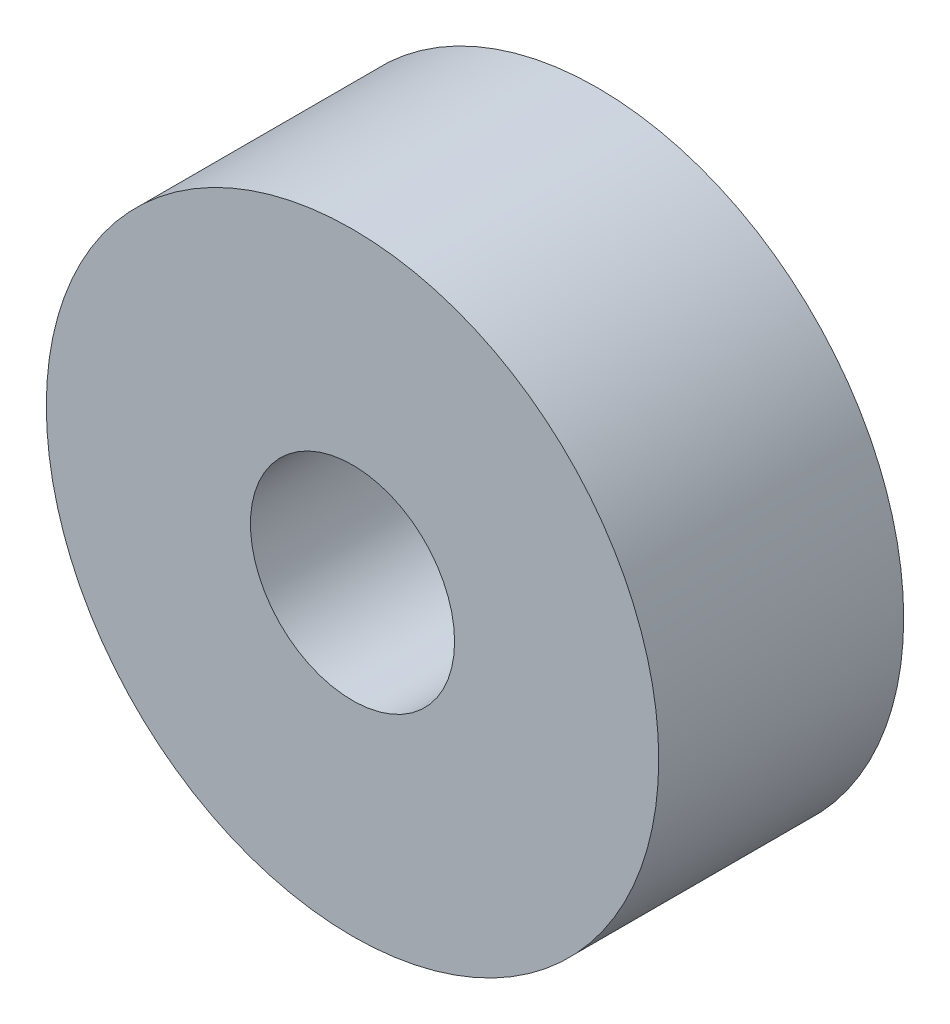
ISO-10303-21;
HEADER;
FILE_DESCRIPTION(('STEP AP214'),'2;1');
FILE_NAME('part.step','',(''),(''),'','','');
FILE_SCHEMA(('AUTOMOTIVE_DESIGN { 1 0 10303 214 1 1 1 1 }'));
ENDSEC;
DATA;
#1=APPLICATION_CONTEXT('core data for automotive mechanical design processes');
#2=APPLICATION_PROTOCOL_DEFINITION('international standard','automotive_design',2000,#1);
#3=PRODUCT_CONTEXT('',#1,'mechanical');
#4=PRODUCT('Part','Part','',(#3));
#5=PRODUCT_RELATED_PRODUCT_CATEGORY('part','',(#4));
#6=PRODUCT_DEFINITION_FORMATION('','',#4);
#7=PRODUCT_DEFINITION_CONTEXT('part definition',#1,'design');
#8=PRODUCT_DEFINITION('design','',#6,#7);
#9=PRODUCT_DEFINITION_SHAPE('','',#8);
#10=(LENGTH_UNIT() NAMED_UNIT(*) SI_UNIT(.MILLI.,.METRE.));
#11=(NAMED_UNIT(*) PLANE_ANGLE_UNIT() SI_UNIT($,.RADIAN.));
#12=(NAMED_UNIT(*) SI_UNIT($,.STERADIAN.) SOLID_ANGLE_UNIT());
#13=UNCERTAINTY_MEASURE_WITH_UNIT(LENGTH_MEASURE(1.E-05),#10,'distance_accuracy_value','');
#14=(GEOMETRIC_REPRESENTATION_CONTEXT(3) GLOBAL_UNCERTAINTY_ASSIGNED_CONTEXT((#13)) GLOBAL_UNIT_ASSIGNED_CONTEXT((#10,
#11,#12)) REPRESENTATION_CONTEXT('',''));
#15=CARTESIAN_POINT('',(0.,0.,0.));
#16=DIRECTION('',(0.,0.,1.));
#17=DIRECTION('',(1.,0.,0.));
#18=AXIS2_PLACEMENT_3D('',#15,#16,#17);
#19=CARTESIAN_POINT('',(0.,0.,60.));
#20=DIRECTION('',(0.,0.,-1.));
#21=DIRECTION('',(-1.,0.,0.));
#22=AXIS2_PLACEMENT_3D('',#19,#20,#21);
#23=CYLINDRICAL_SURFACE('',#22,75.);
#24=CARTESIAN_POINT('',(0.,0.,60.));
#25=DIRECTION('',(0.,0.,1.));
#26=DIRECTION('',(1.,0.,0.));
#27=AXIS2_PLACEMENT_3D('',#24,#25,#26);
#28=CIRCLE('',#27,75.);
#29=CARTESIAN_POINT('',(75.,0.,60.));
#30=VERTEX_POINT('',#29);
#31=EDGE_CURVE('E10',#30,#30,#28,.T.);
#32=ORIENTED_EDGE('',*,*,#31,.F.);
#33=EDGE_LOOP('',(#32));
#34=FACE_BOUND('',#33,.T.);
#35=CARTESIAN_POINT('',(0.,0.,0.));
#36=DIRECTION('',(0.,0.,1.));
#37=DIRECTION('',(1.,0.,0.));
#38=AXIS2_PLACEMENT_3D('',#35,#36,#37);
#39=CIRCLE('',#38,75.);
#40=CARTESIAN_POINT('',(75.,0.,0.));
#41=VERTEX_POINT('',#40);
#42=EDGE_CURVE('E33',#41,#41,#39,.T.);
#43=ORIENTED_EDGE('',*,*,#42,.T.);
#44=EDGE_LOOP('',(#43));
#45=FACE_BOUND('',#44,.T.);
#46=ADVANCED_FACE('F30',(#34,#45),#23,.T.);
#47=CARTESIAN_POINT('',(0.,0.,60.));
#48=DIRECTION('',(0.,0.,1.));
#49=DIRECTION('',(1.,0.,0.));
#50=AXIS2_PLACEMENT_3D('',#47,#48,#49);
#51=PLANE('',#50);
#52=CARTESIAN_POINT('',(0.,0.,60.));
#53=DIRECTION('',(0.,0.,1.));
#54=DIRECTION('',(1.,0.,0.));
#55=AXIS2_PLACEMENT_3D('',#52,#53,#54);
#56=CIRCLE('',#55,25.);
#57=CARTESIAN_POINT('',(25.,0.,60.));
#58=VERTEX_POINT('',#57);
#59=EDGE_CURVE('E42',#58,#58,#56,.T.);
#60=ORIENTED_EDGE('',*,*,#59,.F.);
#61=EDGE_LOOP('',(#60));
#62=FACE_BOUND('',#61,.T.);
#63=ORIENTED_EDGE('',*,*,#31,.T.);
#64=EDGE_LOOP('',(#63));
#65=FACE_BOUND('',#64,.T.);
#66=ADVANCED_FACE('F57',(#62,#65),#51,.T.);
#67=CARTESIAN_POINT('',(0.,0.,0.));
#68=DIRECTION('',(0.,0.,1.));
#69=DIRECTION('',(1.,0.,0.));
#70=AXIS2_PLACEMENT_3D('',#67,#68,#69);
#71=PLANE('',#70);
#72=ORIENTED_EDGE('',*,*,#42,.F.);
#73=EDGE_LOOP('',(#72));
#74=FACE_BOUND('',#73,.T.);
#75=ADVANCED_FACE('F53',(#74),#71,.F.);
#76=CARTESIAN_POINT('',(0.,0.,9.99999999999999));
#77=DIRECTION('',(0.,0.,1.));
#78=DIRECTION('',(1.,0.,0.));
#79=AXIS2_PLACEMENT_3D('',#76,#77,#78);
#80=CYLINDRICAL_SURFACE('',#79,25.);
#81=CARTESIAN_POINT('',(0.,0.,9.99999999999999));
#82=DIRECTION('',(0.,0.,1.));
#83=DIRECTION('',(1.,0.,0.));
#84=AXIS2_PLACEMENT_3D('',#81,#82,#83);
#85=CIRCLE('',#84,25.);
#86=CARTESIAN_POINT('',(25.,0.,9.99999999999999));
#87=VERTEX_POINT('',#86);
#88=EDGE_CURVE('E40',#87,#87,#85,.T.);
#89=ORIENTED_EDGE('',*,*,#88,.F.);
#90=EDGE_LOOP('',(#89));
#91=FACE_BOUND('',#90,.T.);
#92=ORIENTED_EDGE('',*,*,#59,.T.);
#93=EDGE_LOOP('',(#92));
#94=FACE_BOUND('',#93,.T.);
#95=ADVANCED_FACE('F50',(#91,#94),#80,.F.);
#96=CARTESIAN_POINT('',(0.,0.,9.99999999999999));
#97=DIRECTION('',(0.,0.,1.));
#98=DIRECTION('',(1.,0.,0.));
#99=AXIS2_PLACEMENT_3D('',#96,#97,#98);
#100=PLANE('',#99);
#101=ORIENTED_EDGE('',*,*,#88,.T.);
#102=EDGE_LOOP('',(#101));
#103=FACE_BOUND('',#102,.T.);
#104=ADVANCED_FACE('F48',(#103),#100,.T.);
#105=CLOSED_SHELL('',(#46,#66,#75,#95,#104));
#106=MANIFOLD_SOLID_BREP('B2',#105);
#107=ADVANCED_BREP_SHAPE_REPRESENTATION('',(#18,#106),#14);
#108=SHAPE_DEFINITION_REPRESENTATION(#9,#107);
ENDSEC;
END-ISO-10303-21;
